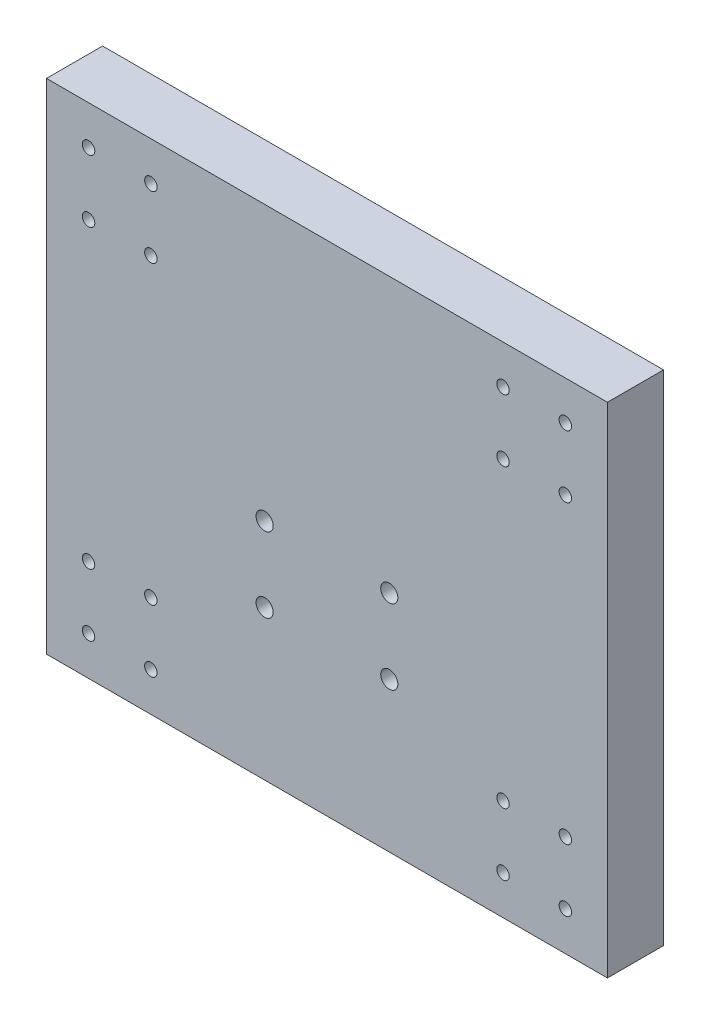
ISO-10303-21;
HEADER;
FILE_DESCRIPTION(('STEP AP214'),'2;1');
FILE_NAME('part.step','',(''),(''),'','','');
FILE_SCHEMA(('AUTOMOTIVE_DESIGN { 1 0 10303 214 1 1 1 1 }'));
ENDSEC;
DATA;
#1=APPLICATION_CONTEXT('core data for automotive mechanical design processes');
#2=APPLICATION_PROTOCOL_DEFINITION('international standard','automotive_design',2000,#1);
#3=PRODUCT_CONTEXT('',#1,'mechanical');
#4=PRODUCT('Part','Part','',(#3));
#5=PRODUCT_RELATED_PRODUCT_CATEGORY('part','',(#4));
#6=PRODUCT_DEFINITION_FORMATION('','',#4);
#7=PRODUCT_DEFINITION_CONTEXT('part definition',#1,'design');
#8=PRODUCT_DEFINITION('design','',#6,#7);
#9=PRODUCT_DEFINITION_SHAPE('','',#8);
#10=(LENGTH_UNIT() NAMED_UNIT(*) SI_UNIT(.MILLI.,.METRE.));
#11=(NAMED_UNIT(*) PLANE_ANGLE_UNIT() SI_UNIT($,.RADIAN.));
#12=(NAMED_UNIT(*) SI_UNIT($,.STERADIAN.) SOLID_ANGLE_UNIT());
#13=UNCERTAINTY_MEASURE_WITH_UNIT(LENGTH_MEASURE(1.E-05),#10,'distance_accuracy_value','');
#14=(GEOMETRIC_REPRESENTATION_CONTEXT(3) GLOBAL_UNCERTAINTY_ASSIGNED_CONTEXT((#13)) GLOBAL_UNIT_ASSIGNED_CONTEXT((#10,
#11,#12)) REPRESENTATION_CONTEXT('',''));
#15=CARTESIAN_POINT('',(0.,0.,0.));
#16=DIRECTION('',(0.,0.,1.));
#17=DIRECTION('',(1.,0.,0.));
#18=AXIS2_PLACEMENT_3D('',#15,#16,#17);
#19=CARTESIAN_POINT('',(0.,0.,-18.));
#20=DIRECTION('',(0.,0.,-1.));
#21=DIRECTION('',(-1.,0.,0.));
#22=AXIS2_PLACEMENT_3D('',#19,#20,#21);
#23=PLANE('',#22);
#24=CARTESIAN_POINT('',(20.,-32.,-18.));
#25=DIRECTION('',(0.,0.,-1.));
#26=DIRECTION('',(1.,0.,0.));
#27=AXIS2_PLACEMENT_3D('',#24,#25,#26);
#28=CIRCLE('',#27,2.74999999999999);
#29=CARTESIAN_POINT('',(22.75,-32.,-18.));
#30=VERTEX_POINT('',#29);
#31=EDGE_CURVE('E312',#30,#30,#28,.T.);
#32=ORIENTED_EDGE('',*,*,#31,.F.);
#33=EDGE_LOOP('',(#32));
#34=FACE_BOUND('',#33,.T.);
#35=CARTESIAN_POINT('',(-20.,-32.,-18.));
#36=DIRECTION('',(0.,0.,-1.));
#37=DIRECTION('',(-1.,0.,0.));
#38=AXIS2_PLACEMENT_3D('',#35,#36,#37);
#39=CIRCLE('',#38,2.74999999999999);
#40=CARTESIAN_POINT('',(-22.75,-32.,-18.));
#41=VERTEX_POINT('',#40);
#42=EDGE_CURVE('E318',#41,#41,#39,.T.);
#43=ORIENTED_EDGE('',*,*,#42,.F.);
#44=EDGE_LOOP('',(#43));
#45=FACE_BOUND('',#44,.T.);
#46=CARTESIAN_POINT('',(-20.,-7.99999999999998,-18.));
#47=DIRECTION('',(0.,0.,-1.));
#48=DIRECTION('',(1.,0.,0.));
#49=AXIS2_PLACEMENT_3D('',#46,#47,#48);
#50=CIRCLE('',#49,2.75);
#51=CARTESIAN_POINT('',(-17.25,-7.99999999999998,-18.));
#52=VERTEX_POINT('',#51);
#53=EDGE_CURVE('E326',#52,#52,#50,.T.);
#54=ORIENTED_EDGE('',*,*,#53,.F.);
#55=EDGE_LOOP('',(#54));
#56=FACE_BOUND('',#55,.T.);
#57=CARTESIAN_POINT('',(20.,-7.99999999999999,-18.));
#58=DIRECTION('',(0.,0.,-1.));
#59=DIRECTION('',(-1.,0.,0.));
#60=AXIS2_PLACEMENT_3D('',#57,#58,#59);
#61=CIRCLE('',#60,2.75);
#62=CARTESIAN_POINT('',(17.25,-7.99999999999999,-18.));
#63=VERTEX_POINT('',#62);
#64=EDGE_CURVE('E315',#63,#63,#61,.T.);
#65=ORIENTED_EDGE('',*,*,#64,.F.);
#66=EDGE_LOOP('',(#65));
#67=FACE_BOUND('',#66,.T.);
#68=CARTESIAN_POINT('',(56.5,-47.5,-18.));
#69=DIRECTION('',(0.,0.,1.));
#70=DIRECTION('',(1.,0.,0.));
#71=AXIS2_PLACEMENT_3D('',#68,#69,#70);
#72=CIRCLE('',#71,2.);
#73=CARTESIAN_POINT('',(58.5,-47.5,-18.));
#74=VERTEX_POINT('',#73);
#75=EDGE_CURVE('E131',#74,#74,#72,.F.);
#76=ORIENTED_EDGE('',*,*,#75,.F.);
#77=EDGE_LOOP('',(#76));
#78=FACE_BOUND('',#77,.T.);
#79=CARTESIAN_POINT('',(56.5,-67.5,-18.));
#80=DIRECTION('',(0.,0.,1.));
#81=DIRECTION('',(1.,0.,0.));
#82=AXIS2_PLACEMENT_3D('',#79,#80,#81);
#83=CIRCLE('',#82,2.);
#84=CARTESIAN_POINT('',(58.5,-67.5,-18.));
#85=VERTEX_POINT('',#84);
#86=EDGE_CURVE('E137',#85,#85,#83,.F.);
#87=ORIENTED_EDGE('',*,*,#86,.F.);
#88=EDGE_LOOP('',(#87));
#89=FACE_BOUND('',#88,.T.);
#90=CARTESIAN_POINT('',(-76.5,-47.5,-18.));
#91=DIRECTION('',(0.,0.,1.));
#92=DIRECTION('',(1.,0.,0.));
#93=AXIS2_PLACEMENT_3D('',#90,#91,#92);
#94=CIRCLE('',#93,2.);
#95=CARTESIAN_POINT('',(-74.5,-47.5,-18.));
#96=VERTEX_POINT('',#95);
#97=EDGE_CURVE('E107',#96,#96,#94,.F.);
#98=ORIENTED_EDGE('',*,*,#97,.F.);
#99=EDGE_LOOP('',(#98));
#100=FACE_BOUND('',#99,.T.);
#101=CARTESIAN_POINT('',(-76.5,-67.5,-18.));
#102=DIRECTION('',(0.,0.,1.));
#103=DIRECTION('',(1.,0.,0.));
#104=AXIS2_PLACEMENT_3D('',#101,#102,#103);
#105=CIRCLE('',#104,2.);
#106=CARTESIAN_POINT('',(-74.5,-67.5,-18.));
#107=VERTEX_POINT('',#106);
#108=EDGE_CURVE('E113',#107,#107,#105,.F.);
#109=ORIENTED_EDGE('',*,*,#108,.F.);
#110=EDGE_LOOP('',(#109));
#111=FACE_BOUND('',#110,.T.);
#112=CARTESIAN_POINT('',(76.5,47.5,-18.));
#113=DIRECTION('',(0.,0.,1.));
#114=DIRECTION('',(1.,0.,0.));
#115=AXIS2_PLACEMENT_3D('',#112,#113,#114);
#116=CIRCLE('',#115,2.);
#117=CARTESIAN_POINT('',(78.5,47.5,-18.));
#118=VERTEX_POINT('',#117);
#119=EDGE_CURVE('E179',#118,#118,#116,.F.);
#120=ORIENTED_EDGE('',*,*,#119,.F.);
#121=EDGE_LOOP('',(#120));
#122=FACE_BOUND('',#121,.T.);
#123=CARTESIAN_POINT('',(76.5,67.5,-18.));
#124=DIRECTION('',(0.,0.,1.));
#125=DIRECTION('',(1.,0.,0.));
#126=AXIS2_PLACEMENT_3D('',#123,#124,#125);
#127=CIRCLE('',#126,2.00000000000002);
#128=CARTESIAN_POINT('',(78.5000000000001,67.5,-18.));
#129=VERTEX_POINT('',#128);
#130=EDGE_CURVE('E173',#129,#129,#127,.F.);
#131=ORIENTED_EDGE('',*,*,#130,.F.);
#132=EDGE_LOOP('',(#131));
#133=FACE_BOUND('',#132,.T.);
#134=CARTESIAN_POINT('',(-56.5,47.5,-18.));
#135=DIRECTION('',(0.,0.,1.));
#136=DIRECTION('',(1.,0.,0.));
#137=AXIS2_PLACEMENT_3D('',#134,#135,#136);
#138=CIRCLE('',#137,2.);
#139=CARTESIAN_POINT('',(-54.5,47.5,-18.));
#140=VERTEX_POINT('',#139);
#141=EDGE_CURVE('E161',#140,#140,#138,.F.);
#142=ORIENTED_EDGE('',*,*,#141,.F.);
#143=EDGE_LOOP('',(#142));
#144=FACE_BOUND('',#143,.T.);
#145=CARTESIAN_POINT('',(-56.5,67.5,-18.));
#146=DIRECTION('',(0.,0.,1.));
#147=DIRECTION('',(1.,0.,0.));
#148=AXIS2_PLACEMENT_3D('',#145,#146,#147);
#149=CIRCLE('',#148,2.);
#150=CARTESIAN_POINT('',(-54.5,67.5,-18.));
#151=VERTEX_POINT('',#150);
#152=EDGE_CURVE('E155',#151,#151,#149,.F.);
#153=ORIENTED_EDGE('',*,*,#152,.F.);
#154=EDGE_LOOP('',(#153));
#155=FACE_BOUND('',#154,.T.);
#156=CARTESIAN_POINT('',(-76.5,67.5,-18.));
#157=DIRECTION('',(0.,0.,1.));
#158=DIRECTION('',(1.,0.,0.));
#159=AXIS2_PLACEMENT_3D('',#156,#157,#158);
#160=CIRCLE('',#159,2.);
#161=CARTESIAN_POINT('',(-74.5,67.5,-18.));
#162=VERTEX_POINT('',#161);
#163=EDGE_CURVE('E193',#162,#162,#160,.T.);
#164=ORIENTED_EDGE('',*,*,#163,.T.);
#165=EDGE_LOOP('',(#164));
#166=FACE_BOUND('',#165,.T.);
#167=DIRECTION('',(-1.,0.,0.));
#168=VECTOR('',#167,1.);
#169=CARTESIAN_POINT('',(-80.,80.,-18.));
#170=LINE('',#169,#168);
#171=CARTESIAN_POINT('',(90.,80.,-18.));
#172=VERTEX_POINT('',#171);
#173=CARTESIAN_POINT('',(-90.,80.,-18.));
#174=VERTEX_POINT('',#173);
#175=EDGE_CURVE('E43',#172,#174,#170,.T.);
#176=ORIENTED_EDGE('',*,*,#175,.F.);
#177=DIRECTION('',(0.,1.,0.));
#178=VECTOR('',#177,1.);
#179=CARTESIAN_POINT('',(90.,-100.591260281974,-18.));
#180=LINE('',#179,#178);
#181=CARTESIAN_POINT('',(90.,-80.,-18.));
#182=VERTEX_POINT('',#181);
#183=EDGE_CURVE('E73',#182,#172,#180,.T.);
#184=ORIENTED_EDGE('',*,*,#183,.F.);
#185=DIRECTION('',(1.,0.,0.));
#186=VECTOR('',#185,1.);
#187=CARTESIAN_POINT('',(-80.,-80.,-18.));
#188=LINE('',#187,#186);
#189=CARTESIAN_POINT('',(-90.,-80.,-18.));
#190=VERTEX_POINT('',#189);
#191=EDGE_CURVE('E11',#190,#182,#188,.T.);
#192=ORIENTED_EDGE('',*,*,#191,.F.);
#193=DIRECTION('',(0.,1.,0.));
#194=VECTOR('',#193,1.);
#195=CARTESIAN_POINT('',(-90.,-100.591260281974,-18.));
#196=LINE('',#195,#194);
#197=EDGE_CURVE('E71',#190,#174,#196,.T.);
#198=ORIENTED_EDGE('',*,*,#197,.T.);
#199=EDGE_LOOP('',(#176,#184,#192,#198));
#200=FACE_BOUND('',#199,.T.);
#201=CARTESIAN_POINT('',(-76.5,47.5,-18.));
#202=DIRECTION('',(0.,0.,1.));
#203=DIRECTION('',(1.,0.,0.));
#204=AXIS2_PLACEMENT_3D('',#201,#202,#203);
#205=CIRCLE('',#204,2.);
#206=CARTESIAN_POINT('',(-74.5,47.5,-18.));
#207=VERTEX_POINT('',#206);
#208=EDGE_CURVE('E167',#207,#207,#205,.T.);
#209=ORIENTED_EDGE('',*,*,#208,.T.);
#210=EDGE_LOOP('',(#209));
#211=FACE_BOUND('',#210,.T.);
#212=CARTESIAN_POINT('',(76.5,-47.5,-18.));
#213=DIRECTION('',(0.,0.,1.));
#214=DIRECTION('',(1.,0.,0.));
#215=AXIS2_PLACEMENT_3D('',#212,#213,#214);
#216=CIRCLE('',#215,2.);
#217=CARTESIAN_POINT('',(78.5,-47.5,-18.));
#218=VERTEX_POINT('',#217);
#219=EDGE_CURVE('E185',#218,#218,#216,.T.);
#220=ORIENTED_EDGE('',*,*,#219,.T.);
#221=EDGE_LOOP('',(#220));
#222=FACE_BOUND('',#221,.T.);
#223=CARTESIAN_POINT('',(76.5,-67.5,-18.));
#224=DIRECTION('',(0.,0.,1.));
#225=DIRECTION('',(1.,0.,0.));
#226=AXIS2_PLACEMENT_3D('',#223,#224,#225);
#227=CIRCLE('',#226,2.00000000000002);
#228=CARTESIAN_POINT('',(78.5000000000001,-67.5,-18.));
#229=VERTEX_POINT('',#228);
#230=EDGE_CURVE('E130',#229,#229,#227,.T.);
#231=ORIENTED_EDGE('',*,*,#230,.T.);
#232=EDGE_LOOP('',(#231));
#233=FACE_BOUND('',#232,.T.);
#234=CARTESIAN_POINT('',(56.5,47.5,-18.));
#235=DIRECTION('',(0.,0.,1.));
#236=DIRECTION('',(1.,0.,0.));
#237=AXIS2_PLACEMENT_3D('',#234,#235,#236);
#238=CIRCLE('',#237,2.);
#239=CARTESIAN_POINT('',(58.5,47.5,-18.));
#240=VERTEX_POINT('',#239);
#241=EDGE_CURVE('E100',#240,#240,#238,.T.);
#242=ORIENTED_EDGE('',*,*,#241,.T.);
#243=EDGE_LOOP('',(#242));
#244=FACE_BOUND('',#243,.T.);
#245=CARTESIAN_POINT('',(56.5,67.5,-18.));
#246=DIRECTION('',(0.,0.,1.));
#247=DIRECTION('',(1.,0.,0.));
#248=AXIS2_PLACEMENT_3D('',#245,#246,#247);
#249=CIRCLE('',#248,2.);
#250=CARTESIAN_POINT('',(58.5,67.5,-18.));
#251=VERTEX_POINT('',#250);
#252=EDGE_CURVE('E119',#251,#251,#249,.T.);
#253=ORIENTED_EDGE('',*,*,#252,.T.);
#254=EDGE_LOOP('',(#253));
#255=FACE_BOUND('',#254,.T.);
#256=CARTESIAN_POINT('',(-56.5,-67.5,-18.));
#257=DIRECTION('',(0.,0.,1.));
#258=DIRECTION('',(1.,0.,0.));
#259=AXIS2_PLACEMENT_3D('',#256,#257,#258);
#260=CIRCLE('',#259,2.);
#261=CARTESIAN_POINT('',(-54.5,-67.5,-18.));
#262=VERTEX_POINT('',#261);
#263=EDGE_CURVE('E106',#262,#262,#260,.T.);
#264=ORIENTED_EDGE('',*,*,#263,.T.);
#265=EDGE_LOOP('',(#264));
#266=FACE_BOUND('',#265,.T.);
#267=CARTESIAN_POINT('',(-56.5,-47.5,-18.));
#268=DIRECTION('',(0.,0.,1.));
#269=DIRECTION('',(1.,0.,0.));
#270=AXIS2_PLACEMENT_3D('',#267,#268,#269);
#271=CIRCLE('',#270,2.);
#272=CARTESIAN_POINT('',(-54.5,-47.5,-18.));
#273=VERTEX_POINT('',#272);
#274=EDGE_CURVE('E143',#273,#273,#271,.T.);
#275=ORIENTED_EDGE('',*,*,#274,.T.);
#276=EDGE_LOOP('',(#275));
#277=FACE_BOUND('',#276,.T.);
#278=ADVANCED_FACE('F33',(#34,#45,#56,#67,#78,#89,#100,#111,#122,#133,#144,#155,#166,#200,#211,
#222,#233,#244,#255,#266,#277),#23,.T.);
#279=CARTESIAN_POINT('',(0.,0.,0.));
#280=DIRECTION('',(0.,0.,-1.));
#281=DIRECTION('',(-1.,0.,0.));
#282=AXIS2_PLACEMENT_3D('',#279,#280,#281);
#283=PLANE('',#282);
#284=CARTESIAN_POINT('',(20.,-32.,0.));
#285=DIRECTION('',(0.,0.,-1.));
#286=DIRECTION('',(1.,0.,0.));
#287=AXIS2_PLACEMENT_3D('',#284,#285,#286);
#288=CIRCLE('',#287,2.74999999999999);
#289=CARTESIAN_POINT('',(22.75,-32.,0.));
#290=VERTEX_POINT('',#289);
#291=EDGE_CURVE('E310',#290,#290,#288,.T.);
#292=ORIENTED_EDGE('',*,*,#291,.T.);
#293=EDGE_LOOP('',(#292));
#294=FACE_BOUND('',#293,.T.);
#295=CARTESIAN_POINT('',(-20.,-32.,0.));
#296=DIRECTION('',(0.,0.,-1.));
#297=DIRECTION('',(-1.,0.,0.));
#298=AXIS2_PLACEMENT_3D('',#295,#296,#297);
#299=CIRCLE('',#298,2.74999999999999);
#300=CARTESIAN_POINT('',(-22.75,-32.,0.));
#301=VERTEX_POINT('',#300);
#302=EDGE_CURVE('E313',#301,#301,#299,.T.);
#303=ORIENTED_EDGE('',*,*,#302,.T.);
#304=EDGE_LOOP('',(#303));
#305=FACE_BOUND('',#304,.T.);
#306=CARTESIAN_POINT('',(-20.,-7.99999999999998,0.));
#307=DIRECTION('',(0.,0.,-1.));
#308=DIRECTION('',(1.,0.,0.));
#309=AXIS2_PLACEMENT_3D('',#306,#307,#308);
#310=CIRCLE('',#309,2.75);
#311=CARTESIAN_POINT('',(-17.25,-7.99999999999998,0.));
#312=VERTEX_POINT('',#311);
#313=EDGE_CURVE('E323',#312,#312,#310,.T.);
#314=ORIENTED_EDGE('',*,*,#313,.T.);
#315=EDGE_LOOP('',(#314));
#316=FACE_BOUND('',#315,.T.);
#317=CARTESIAN_POINT('',(20.,-7.99999999999999,0.));
#318=DIRECTION('',(0.,0.,-1.));
#319=DIRECTION('',(-1.,0.,0.));
#320=AXIS2_PLACEMENT_3D('',#317,#318,#319);
#321=CIRCLE('',#320,2.75);
#322=CARTESIAN_POINT('',(17.25,-7.99999999999999,0.));
#323=VERTEX_POINT('',#322);
#324=EDGE_CURVE('E89',#323,#323,#321,.T.);
#325=ORIENTED_EDGE('',*,*,#324,.T.);
#326=EDGE_LOOP('',(#325));
#327=FACE_BOUND('',#326,.T.);
#328=CARTESIAN_POINT('',(56.5,-47.5,0.));
#329=DIRECTION('',(0.,0.,1.));
#330=DIRECTION('',(1.,0.,0.));
#331=AXIS2_PLACEMENT_3D('',#328,#329,#330);
#332=CIRCLE('',#331,2.);
#333=CARTESIAN_POINT('',(58.5,-47.5,0.));
#334=VERTEX_POINT('',#333);
#335=EDGE_CURVE('E127',#334,#334,#332,.F.);
#336=ORIENTED_EDGE('',*,*,#335,.T.);
#337=EDGE_LOOP('',(#336));
#338=FACE_BOUND('',#337,.T.);
#339=CARTESIAN_POINT('',(56.5,-67.5,0.));
#340=DIRECTION('',(0.,0.,1.));
#341=DIRECTION('',(1.,0.,0.));
#342=AXIS2_PLACEMENT_3D('',#339,#340,#341);
#343=CIRCLE('',#342,2.);
#344=CARTESIAN_POINT('',(58.5,-67.5,0.));
#345=VERTEX_POINT('',#344);
#346=EDGE_CURVE('E134',#345,#345,#343,.F.);
#347=ORIENTED_EDGE('',*,*,#346,.T.);
#348=EDGE_LOOP('',(#347));
#349=FACE_BOUND('',#348,.T.);
#350=CARTESIAN_POINT('',(-56.5,-67.5,0.));
#351=DIRECTION('',(0.,0.,1.));
#352=DIRECTION('',(1.,0.,0.));
#353=AXIS2_PLACEMENT_3D('',#350,#351,#352);
#354=CIRCLE('',#353,2.);
#355=CARTESIAN_POINT('',(-54.5,-67.5,0.));
#356=VERTEX_POINT('',#355);
#357=EDGE_CURVE('E146',#356,#356,#354,.T.);
#358=ORIENTED_EDGE('',*,*,#357,.F.);
#359=EDGE_LOOP('',(#358));
#360=FACE_BOUND('',#359,.T.);
#361=CARTESIAN_POINT('',(-76.5,-47.5,0.));
#362=DIRECTION('',(0.,0.,1.));
#363=DIRECTION('',(1.,0.,0.));
#364=AXIS2_PLACEMENT_3D('',#361,#362,#363);
#365=CIRCLE('',#364,2.);
#366=CARTESIAN_POINT('',(-74.5,-47.5,0.));
#367=VERTEX_POINT('',#366);
#368=EDGE_CURVE('E103',#367,#367,#365,.F.);
#369=ORIENTED_EDGE('',*,*,#368,.T.);
#370=EDGE_LOOP('',(#369));
#371=FACE_BOUND('',#370,.T.);
#372=CARTESIAN_POINT('',(-76.5,-67.5,0.));
#373=DIRECTION('',(0.,0.,1.));
#374=DIRECTION('',(1.,0.,0.));
#375=AXIS2_PLACEMENT_3D('',#372,#373,#374);
#376=CIRCLE('',#375,2.);
#377=CARTESIAN_POINT('',(-74.5,-67.5,0.));
#378=VERTEX_POINT('',#377);
#379=EDGE_CURVE('E110',#378,#378,#376,.F.);
#380=ORIENTED_EDGE('',*,*,#379,.T.);
#381=EDGE_LOOP('',(#380));
#382=FACE_BOUND('',#381,.T.);
#383=CARTESIAN_POINT('',(56.5,47.5,0.));
#384=DIRECTION('',(0.,0.,1.));
#385=DIRECTION('',(1.,0.,0.));
#386=AXIS2_PLACEMENT_3D('',#383,#384,#385);
#387=CIRCLE('',#386,2.);
#388=CARTESIAN_POINT('',(58.5,47.5,0.));
#389=VERTEX_POINT('',#388);
#390=EDGE_CURVE('E122',#389,#389,#387,.T.);
#391=ORIENTED_EDGE('',*,*,#390,.F.);
#392=EDGE_LOOP('',(#391));
#393=FACE_BOUND('',#392,.T.);
#394=CARTESIAN_POINT('',(76.5,-47.5,0.));
#395=DIRECTION('',(0.,0.,1.));
#396=DIRECTION('',(1.,0.,0.));
#397=AXIS2_PLACEMENT_3D('',#394,#395,#396);
#398=CIRCLE('',#397,2.);
#399=CARTESIAN_POINT('',(78.5,-47.5,0.));
#400=VERTEX_POINT('',#399);
#401=EDGE_CURVE('E182',#400,#400,#398,.T.);
#402=ORIENTED_EDGE('',*,*,#401,.F.);
#403=EDGE_LOOP('',(#402));
#404=FACE_BOUND('',#403,.T.);
#405=CARTESIAN_POINT('',(76.5,47.5,0.));
#406=DIRECTION('',(0.,0.,1.));
#407=DIRECTION('',(1.,0.,0.));
#408=AXIS2_PLACEMENT_3D('',#405,#406,#407);
#409=CIRCLE('',#408,2.);
#410=CARTESIAN_POINT('',(78.5,47.5,0.));
#411=VERTEX_POINT('',#410);
#412=EDGE_CURVE('E176',#411,#411,#409,.F.);
#413=ORIENTED_EDGE('',*,*,#412,.T.);
#414=EDGE_LOOP('',(#413));
#415=FACE_BOUND('',#414,.T.);
#416=CARTESIAN_POINT('',(76.5,67.5,0.));
#417=DIRECTION('',(0.,0.,1.));
#418=DIRECTION('',(1.,0.,0.));
#419=AXIS2_PLACEMENT_3D('',#416,#417,#418);
#420=CIRCLE('',#419,2.00000000000002);
#421=CARTESIAN_POINT('',(78.5000000000001,67.5,0.));
#422=VERTEX_POINT('',#421);
#423=EDGE_CURVE('E170',#422,#422,#420,.F.);
#424=ORIENTED_EDGE('',*,*,#423,.T.);
#425=EDGE_LOOP('',(#424));
#426=FACE_BOUND('',#425,.T.);
#427=DIRECTION('',(1.,0.,0.));
#428=VECTOR('',#427,1.);
#429=CARTESIAN_POINT('',(-80.,-80.,0.));
#430=LINE('',#429,#428);
#431=CARTESIAN_POINT('',(-90.,-80.,0.));
#432=VERTEX_POINT('',#431);
#433=CARTESIAN_POINT('',(90.,-80.,0.));
#434=VERTEX_POINT('',#433);
#435=EDGE_CURVE('E37',#432,#434,#430,.T.);
#436=ORIENTED_EDGE('',*,*,#435,.T.);
#437=DIRECTION('',(0.,1.,0.));
#438=VECTOR('',#437,1.);
#439=CARTESIAN_POINT('',(90.,-100.591260281974,0.));
#440=LINE('',#439,#438);
#441=CARTESIAN_POINT('',(90.,80.,0.));
#442=VERTEX_POINT('',#441);
#443=EDGE_CURVE('E96',#434,#442,#440,.T.);
#444=ORIENTED_EDGE('',*,*,#443,.T.);
#445=DIRECTION('',(-1.,0.,0.));
#446=VECTOR('',#445,1.);
#447=CARTESIAN_POINT('',(-80.,80.,0.));
#448=LINE('',#447,#446);
#449=CARTESIAN_POINT('',(-90.,80.,0.));
#450=VERTEX_POINT('',#449);
#451=EDGE_CURVE('E196',#442,#450,#448,.T.);
#452=ORIENTED_EDGE('',*,*,#451,.T.);
#453=DIRECTION('',(0.,1.,0.));
#454=VECTOR('',#453,1.);
#455=CARTESIAN_POINT('',(-90.,-100.591260281974,0.));
#456=LINE('',#455,#454);
#457=EDGE_CURVE('E83',#432,#450,#456,.T.);
#458=ORIENTED_EDGE('',*,*,#457,.F.);
#459=EDGE_LOOP('',(#436,#444,#452,#458));
#460=FACE_BOUND('',#459,.T.);
#461=CARTESIAN_POINT('',(-76.5,67.5,0.));
#462=DIRECTION('',(0.,0.,1.));
#463=DIRECTION('',(1.,0.,0.));
#464=AXIS2_PLACEMENT_3D('',#461,#462,#463);
#465=CIRCLE('',#464,2.);
#466=CARTESIAN_POINT('',(-74.5,67.5,0.));
#467=VERTEX_POINT('',#466);
#468=EDGE_CURVE('E154',#467,#467,#465,.T.);
#469=ORIENTED_EDGE('',*,*,#468,.F.);
#470=EDGE_LOOP('',(#469));
#471=FACE_BOUND('',#470,.T.);
#472=CARTESIAN_POINT('',(-56.5,67.5,0.));
#473=DIRECTION('',(0.,0.,1.));
#474=DIRECTION('',(1.,0.,0.));
#475=AXIS2_PLACEMENT_3D('',#472,#473,#474);
#476=CIRCLE('',#475,2.);
#477=CARTESIAN_POINT('',(-54.5,67.5,0.));
#478=VERTEX_POINT('',#477);
#479=EDGE_CURVE('E151',#478,#478,#476,.F.);
#480=ORIENTED_EDGE('',*,*,#479,.T.);
#481=EDGE_LOOP('',(#480));
#482=FACE_BOUND('',#481,.T.);
#483=CARTESIAN_POINT('',(-56.5,47.5,0.));
#484=DIRECTION('',(0.,0.,1.));
#485=DIRECTION('',(1.,0.,0.));
#486=AXIS2_PLACEMENT_3D('',#483,#484,#485);
#487=CIRCLE('',#486,2.);
#488=CARTESIAN_POINT('',(-54.5,47.5,0.));
#489=VERTEX_POINT('',#488);
#490=EDGE_CURVE('E158',#489,#489,#487,.F.);
#491=ORIENTED_EDGE('',*,*,#490,.T.);
#492=EDGE_LOOP('',(#491));
#493=FACE_BOUND('',#492,.T.);
#494=CARTESIAN_POINT('',(-76.5,47.5,0.));
#495=DIRECTION('',(0.,0.,1.));
#496=DIRECTION('',(1.,0.,0.));
#497=AXIS2_PLACEMENT_3D('',#494,#495,#496);
#498=CIRCLE('',#497,2.);
#499=CARTESIAN_POINT('',(-74.5,47.5,0.));
#500=VERTEX_POINT('',#499);
#501=EDGE_CURVE('E164',#500,#500,#498,.T.);
#502=ORIENTED_EDGE('',*,*,#501,.F.);
#503=EDGE_LOOP('',(#502));
#504=FACE_BOUND('',#503,.T.);
#505=CARTESIAN_POINT('',(76.5,-67.5,0.));
#506=DIRECTION('',(0.,0.,1.));
#507=DIRECTION('',(1.,0.,0.));
#508=AXIS2_PLACEMENT_3D('',#505,#506,#507);
#509=CIRCLE('',#508,2.00000000000002);
#510=CARTESIAN_POINT('',(78.5000000000001,-67.5,0.));
#511=VERTEX_POINT('',#510);
#512=EDGE_CURVE('E188',#511,#511,#509,.T.);
#513=ORIENTED_EDGE('',*,*,#512,.F.);
#514=EDGE_LOOP('',(#513));
#515=FACE_BOUND('',#514,.T.);
#516=CARTESIAN_POINT('',(56.5,67.5,0.));
#517=DIRECTION('',(0.,0.,1.));
#518=DIRECTION('',(1.,0.,0.));
#519=AXIS2_PLACEMENT_3D('',#516,#517,#518);
#520=CIRCLE('',#519,2.);
#521=CARTESIAN_POINT('',(58.5,67.5,0.));
#522=VERTEX_POINT('',#521);
#523=EDGE_CURVE('E116',#522,#522,#520,.T.);
#524=ORIENTED_EDGE('',*,*,#523,.F.);
#525=EDGE_LOOP('',(#524));
#526=FACE_BOUND('',#525,.T.);
#527=CARTESIAN_POINT('',(-56.5,-47.5,0.));
#528=DIRECTION('',(0.,0.,1.));
#529=DIRECTION('',(1.,0.,0.));
#530=AXIS2_PLACEMENT_3D('',#527,#528,#529);
#531=CIRCLE('',#530,2.);
#532=CARTESIAN_POINT('',(-54.5,-47.5,0.));
#533=VERTEX_POINT('',#532);
#534=EDGE_CURVE('E140',#533,#533,#531,.T.);
#535=ORIENTED_EDGE('',*,*,#534,.F.);
#536=EDGE_LOOP('',(#535));
#537=FACE_BOUND('',#536,.T.);
#538=ADVANCED_FACE('F200',(#294,#305,#316,#327,#338,#349,#360,#371,#382,#393,#404,#415,#426,
#460,#471,#482,#493,#504,#515,#526,#537),#283,.F.);
#539=CARTESIAN_POINT('',(-80.,-80.,-18.));
#540=DIRECTION('',(0.,-1.,0.));
#541=DIRECTION('',(0.,0.,-1.));
#542=AXIS2_PLACEMENT_3D('',#539,#540,#541);
#543=PLANE('',#542);
#544=ORIENTED_EDGE('',*,*,#435,.F.);
#545=DIRECTION('',(0.,0.,1.));
#546=VECTOR('',#545,1.);
#547=CARTESIAN_POINT('',(-90.,-80.,-18.));
#548=LINE('',#547,#546);
#549=EDGE_CURVE('E78',#190,#432,#548,.T.);
#550=ORIENTED_EDGE('',*,*,#549,.F.);
#551=ORIENTED_EDGE('',*,*,#191,.T.);
#552=DIRECTION('',(0.,0.,-1.));
#553=VECTOR('',#552,1.);
#554=CARTESIAN_POINT('',(90.,-80.,0.));
#555=LINE('',#554,#553);
#556=EDGE_CURVE('E97',#434,#182,#555,.T.);
#557=ORIENTED_EDGE('',*,*,#556,.F.);
#558=EDGE_LOOP('',(#544,#550,#551,#557));
#559=FACE_BOUND('',#558,.T.);
#560=ADVANCED_FACE('F79',(#559),#543,.T.);
#561=CARTESIAN_POINT('',(-80.,80.,-18.));
#562=DIRECTION('',(0.,1.,0.));
#563=DIRECTION('',(0.,0.,1.));
#564=AXIS2_PLACEMENT_3D('',#561,#562,#563);
#565=PLANE('',#564);
#566=ORIENTED_EDGE('',*,*,#451,.F.);
#567=DIRECTION('',(0.,0.,-1.));
#568=VECTOR('',#567,1.);
#569=CARTESIAN_POINT('',(90.,80.,0.));
#570=LINE('',#569,#568);
#571=EDGE_CURVE('E93',#442,#172,#570,.T.);
#572=ORIENTED_EDGE('',*,*,#571,.T.);
#573=ORIENTED_EDGE('',*,*,#175,.T.);
#574=DIRECTION('',(0.,0.,1.));
#575=VECTOR('',#574,1.);
#576=CARTESIAN_POINT('',(-90.,80.,-18.));
#577=LINE('',#576,#575);
#578=EDGE_CURVE('E87',#174,#450,#577,.T.);
#579=ORIENTED_EDGE('',*,*,#578,.T.);
#580=EDGE_LOOP('',(#566,#572,#573,#579));
#581=FACE_BOUND('',#580,.T.);
#582=ADVANCED_FACE('F35',(#581),#565,.T.);
#583=CARTESIAN_POINT('',(-76.5,67.5,-18.));
#584=DIRECTION('',(0.,0.,1.));
#585=DIRECTION('',(1.,0.,0.));
#586=AXIS2_PLACEMENT_3D('',#583,#584,#585);
#587=CYLINDRICAL_SURFACE('',#586,2.);
#588=ORIENTED_EDGE('',*,*,#163,.F.);
#589=EDGE_LOOP('',(#588));
#590=FACE_BOUND('',#589,.T.);
#591=ORIENTED_EDGE('',*,*,#468,.T.);
#592=EDGE_LOOP('',(#591));
#593=FACE_BOUND('',#592,.T.);
#594=ADVANCED_FACE('F208',(#590,#593),#587,.F.);
#595=CARTESIAN_POINT('',(-56.5,67.5,-18.));
#596=DIRECTION('',(0.,0.,1.));
#597=DIRECTION('',(1.,0.,0.));
#598=AXIS2_PLACEMENT_3D('',#595,#596,#597);
#599=CYLINDRICAL_SURFACE('',#598,2.);
#600=ORIENTED_EDGE('',*,*,#152,.T.);
#601=EDGE_LOOP('',(#600));
#602=FACE_BOUND('',#601,.T.);
#603=ORIENTED_EDGE('',*,*,#479,.F.);
#604=EDGE_LOOP('',(#603));
#605=FACE_BOUND('',#604,.T.);
#606=ADVANCED_FACE('F213',(#602,#605),#599,.F.);
#607=CARTESIAN_POINT('',(-56.5,47.5,-18.));
#608=DIRECTION('',(0.,0.,1.));
#609=DIRECTION('',(1.,0.,0.));
#610=AXIS2_PLACEMENT_3D('',#607,#608,#609);
#611=CYLINDRICAL_SURFACE('',#610,2.);
#612=ORIENTED_EDGE('',*,*,#141,.T.);
#613=EDGE_LOOP('',(#612));
#614=FACE_BOUND('',#613,.T.);
#615=ORIENTED_EDGE('',*,*,#490,.F.);
#616=EDGE_LOOP('',(#615));
#617=FACE_BOUND('',#616,.T.);
#618=ADVANCED_FACE('F247',(#614,#617),#611,.F.);
#619=CARTESIAN_POINT('',(-76.5,47.5,-18.));
#620=DIRECTION('',(0.,0.,1.));
#621=DIRECTION('',(1.,0.,0.));
#622=AXIS2_PLACEMENT_3D('',#619,#620,#621);
#623=CYLINDRICAL_SURFACE('',#622,2.);
#624=ORIENTED_EDGE('',*,*,#208,.F.);
#625=EDGE_LOOP('',(#624));
#626=FACE_BOUND('',#625,.T.);
#627=ORIENTED_EDGE('',*,*,#501,.T.);
#628=EDGE_LOOP('',(#627));
#629=FACE_BOUND('',#628,.T.);
#630=ADVANCED_FACE('F243',(#626,#629),#623,.F.);
#631=CARTESIAN_POINT('',(76.5,67.5,-18.));
#632=DIRECTION('',(0.,0.,1.));
#633=DIRECTION('',(1.,0.,0.));
#634=AXIS2_PLACEMENT_3D('',#631,#632,#633);
#635=CYLINDRICAL_SURFACE('',#634,2.00000000000002);
#636=ORIENTED_EDGE('',*,*,#130,.T.);
#637=EDGE_LOOP('',(#636));
#638=FACE_BOUND('',#637,.T.);
#639=ORIENTED_EDGE('',*,*,#423,.F.);
#640=EDGE_LOOP('',(#639));
#641=FACE_BOUND('',#640,.T.);
#642=ADVANCED_FACE('F239',(#638,#641),#635,.F.);
#643=CARTESIAN_POINT('',(76.5,47.5,-18.));
#644=DIRECTION('',(0.,0.,1.));
#645=DIRECTION('',(1.,0.,0.));
#646=AXIS2_PLACEMENT_3D('',#643,#644,#645);
#647=CYLINDRICAL_SURFACE('',#646,2.);
#648=ORIENTED_EDGE('',*,*,#119,.T.);
#649=EDGE_LOOP('',(#648));
#650=FACE_BOUND('',#649,.T.);
#651=ORIENTED_EDGE('',*,*,#412,.F.);
#652=EDGE_LOOP('',(#651));
#653=FACE_BOUND('',#652,.T.);
#654=ADVANCED_FACE('F235',(#650,#653),#647,.F.);
#655=CARTESIAN_POINT('',(76.5,-47.5,-18.));
#656=DIRECTION('',(0.,0.,1.));
#657=DIRECTION('',(1.,0.,0.));
#658=AXIS2_PLACEMENT_3D('',#655,#656,#657);
#659=CYLINDRICAL_SURFACE('',#658,2.);
#660=ORIENTED_EDGE('',*,*,#219,.F.);
#661=EDGE_LOOP('',(#660));
#662=FACE_BOUND('',#661,.T.);
#663=ORIENTED_EDGE('',*,*,#401,.T.);
#664=EDGE_LOOP('',(#663));
#665=FACE_BOUND('',#664,.T.);
#666=ADVANCED_FACE('F231',(#662,#665),#659,.F.);
#667=CARTESIAN_POINT('',(76.5,-67.5,-18.));
#668=DIRECTION('',(0.,0.,1.));
#669=DIRECTION('',(1.,0.,0.));
#670=AXIS2_PLACEMENT_3D('',#667,#668,#669);
#671=CYLINDRICAL_SURFACE('',#670,2.00000000000002);
#672=ORIENTED_EDGE('',*,*,#230,.F.);
#673=EDGE_LOOP('',(#672));
#674=FACE_BOUND('',#673,.T.);
#675=ORIENTED_EDGE('',*,*,#512,.T.);
#676=EDGE_LOOP('',(#675));
#677=FACE_BOUND('',#676,.T.);
#678=ADVANCED_FACE('F227',(#674,#677),#671,.F.);
#679=CARTESIAN_POINT('',(56.5,47.5,-18.));
#680=DIRECTION('',(0.,0.,1.));
#681=DIRECTION('',(1.,0.,0.));
#682=AXIS2_PLACEMENT_3D('',#679,#680,#681);
#683=CYLINDRICAL_SURFACE('',#682,2.);
#684=ORIENTED_EDGE('',*,*,#241,.F.);
#685=EDGE_LOOP('',(#684));
#686=FACE_BOUND('',#685,.T.);
#687=ORIENTED_EDGE('',*,*,#390,.T.);
#688=EDGE_LOOP('',(#687));
#689=FACE_BOUND('',#688,.T.);
#690=ADVANCED_FACE('F230',(#686,#689),#683,.F.);
#691=CARTESIAN_POINT('',(56.5,67.5,-18.));
#692=DIRECTION('',(0.,0.,1.));
#693=DIRECTION('',(1.,0.,0.));
#694=AXIS2_PLACEMENT_3D('',#691,#692,#693);
#695=CYLINDRICAL_SURFACE('',#694,2.);
#696=ORIENTED_EDGE('',*,*,#252,.F.);
#697=EDGE_LOOP('',(#696));
#698=FACE_BOUND('',#697,.T.);
#699=ORIENTED_EDGE('',*,*,#523,.T.);
#700=EDGE_LOOP('',(#699));
#701=FACE_BOUND('',#700,.T.);
#702=ADVANCED_FACE('F274',(#698,#701),#695,.F.);
#703=CARTESIAN_POINT('',(-76.5,-67.5,-18.));
#704=DIRECTION('',(0.,0.,1.));
#705=DIRECTION('',(1.,0.,0.));
#706=AXIS2_PLACEMENT_3D('',#703,#704,#705);
#707=CYLINDRICAL_SURFACE('',#706,2.);
#708=ORIENTED_EDGE('',*,*,#108,.T.);
#709=EDGE_LOOP('',(#708));
#710=FACE_BOUND('',#709,.T.);
#711=ORIENTED_EDGE('',*,*,#379,.F.);
#712=EDGE_LOOP('',(#711));
#713=FACE_BOUND('',#712,.T.);
#714=ADVANCED_FACE('F278',(#710,#713),#707,.F.);
#715=CARTESIAN_POINT('',(-76.5,-47.5,-18.));
#716=DIRECTION('',(0.,0.,1.));
#717=DIRECTION('',(1.,0.,0.));
#718=AXIS2_PLACEMENT_3D('',#715,#716,#717);
#719=CYLINDRICAL_SURFACE('',#718,2.);
#720=ORIENTED_EDGE('',*,*,#97,.T.);
#721=EDGE_LOOP('',(#720));
#722=FACE_BOUND('',#721,.T.);
#723=ORIENTED_EDGE('',*,*,#368,.F.);
#724=EDGE_LOOP('',(#723));
#725=FACE_BOUND('',#724,.T.);
#726=ADVANCED_FACE('F259',(#722,#725),#719,.F.);
#727=CARTESIAN_POINT('',(-56.5,-67.5,-18.));
#728=DIRECTION('',(0.,0.,1.));
#729=DIRECTION('',(1.,0.,0.));
#730=AXIS2_PLACEMENT_3D('',#727,#728,#729);
#731=CYLINDRICAL_SURFACE('',#730,2.);
#732=ORIENTED_EDGE('',*,*,#263,.F.);
#733=EDGE_LOOP('',(#732));
#734=FACE_BOUND('',#733,.T.);
#735=ORIENTED_EDGE('',*,*,#357,.T.);
#736=EDGE_LOOP('',(#735));
#737=FACE_BOUND('',#736,.T.);
#738=ADVANCED_FACE('F255',(#734,#737),#731,.F.);
#739=CARTESIAN_POINT('',(-56.5,-47.5,-18.));
#740=DIRECTION('',(0.,0.,1.));
#741=DIRECTION('',(1.,0.,0.));
#742=AXIS2_PLACEMENT_3D('',#739,#740,#741);
#743=CYLINDRICAL_SURFACE('',#742,2.);
#744=ORIENTED_EDGE('',*,*,#274,.F.);
#745=EDGE_LOOP('',(#744));
#746=FACE_BOUND('',#745,.T.);
#747=ORIENTED_EDGE('',*,*,#534,.T.);
#748=EDGE_LOOP('',(#747));
#749=FACE_BOUND('',#748,.T.);
#750=ADVANCED_FACE('F258',(#746,#749),#743,.F.);
#751=CARTESIAN_POINT('',(56.5,-67.5,-18.));
#752=DIRECTION('',(0.,0.,1.));
#753=DIRECTION('',(1.,0.,0.));
#754=AXIS2_PLACEMENT_3D('',#751,#752,#753);
#755=CYLINDRICAL_SURFACE('',#754,2.);
#756=ORIENTED_EDGE('',*,*,#86,.T.);
#757=EDGE_LOOP('',(#756));
#758=FACE_BOUND('',#757,.T.);
#759=ORIENTED_EDGE('',*,*,#346,.F.);
#760=EDGE_LOOP('',(#759));
#761=FACE_BOUND('',#760,.T.);
#762=ADVANCED_FACE('F263',(#758,#761),#755,.F.);
#763=CARTESIAN_POINT('',(56.5,-47.5,-18.));
#764=DIRECTION('',(0.,0.,1.));
#765=DIRECTION('',(1.,0.,0.));
#766=AXIS2_PLACEMENT_3D('',#763,#764,#765);
#767=CYLINDRICAL_SURFACE('',#766,2.);
#768=ORIENTED_EDGE('',*,*,#75,.T.);
#769=EDGE_LOOP('',(#768));
#770=FACE_BOUND('',#769,.T.);
#771=ORIENTED_EDGE('',*,*,#335,.F.);
#772=EDGE_LOOP('',(#771));
#773=FACE_BOUND('',#772,.T.);
#774=ADVANCED_FACE('F267',(#770,#773),#767,.F.);
#775=CARTESIAN_POINT('',(90.,-100.591260281974,0.));
#776=DIRECTION('',(1.,0.,0.));
#777=DIRECTION('',(0.,0.,-1.));
#778=AXIS2_PLACEMENT_3D('',#775,#776,#777);
#779=PLANE('',#778);
#780=ORIENTED_EDGE('',*,*,#443,.F.);
#781=ORIENTED_EDGE('',*,*,#556,.T.);
#782=ORIENTED_EDGE('',*,*,#183,.T.);
#783=ORIENTED_EDGE('',*,*,#571,.F.);
#784=EDGE_LOOP('',(#780,#781,#782,#783));
#785=FACE_BOUND('',#784,.T.);
#786=ADVANCED_FACE('F205',(#785),#779,.T.);
#787=CARTESIAN_POINT('',(-90.,-100.591260281974,-18.));
#788=DIRECTION('',(-1.,0.,0.));
#789=DIRECTION('',(0.,0.,1.));
#790=AXIS2_PLACEMENT_3D('',#787,#788,#789);
#791=PLANE('',#790);
#792=ORIENTED_EDGE('',*,*,#197,.F.);
#793=ORIENTED_EDGE('',*,*,#549,.T.);
#794=ORIENTED_EDGE('',*,*,#457,.T.);
#795=ORIENTED_EDGE('',*,*,#578,.F.);
#796=EDGE_LOOP('',(#792,#793,#794,#795));
#797=FACE_BOUND('',#796,.T.);
#798=ADVANCED_FACE('F85',(#797),#791,.T.);
#799=CARTESIAN_POINT('',(20.,-7.99999999999999,0.));
#800=DIRECTION('',(0.,0.,-1.));
#801=DIRECTION('',(-1.,0.,0.));
#802=AXIS2_PLACEMENT_3D('',#799,#800,#801);
#803=CYLINDRICAL_SURFACE('',#802,2.75);
#804=ORIENTED_EDGE('',*,*,#324,.F.);
#805=EDGE_LOOP('',(#804));
#806=FACE_BOUND('',#805,.T.);
#807=ORIENTED_EDGE('',*,*,#64,.T.);
#808=EDGE_LOOP('',(#807));
#809=FACE_BOUND('',#808,.T.);
#810=ADVANCED_FACE('F290',(#806,#809),#803,.F.);
#811=CARTESIAN_POINT('',(-20.,-7.99999999999998,0.));
#812=DIRECTION('',(0.,0.,-1.));
#813=DIRECTION('',(-1.,0.,0.));
#814=AXIS2_PLACEMENT_3D('',#811,#812,#813);
#815=CYLINDRICAL_SURFACE('',#814,2.75);
#816=ORIENTED_EDGE('',*,*,#313,.F.);
#817=EDGE_LOOP('',(#816));
#818=FACE_BOUND('',#817,.T.);
#819=ORIENTED_EDGE('',*,*,#53,.T.);
#820=EDGE_LOOP('',(#819));
#821=FACE_BOUND('',#820,.T.);
#822=ADVANCED_FACE('F293',(#818,#821),#815,.F.);
#823=CARTESIAN_POINT('',(-20.,-32.,0.));
#824=DIRECTION('',(0.,0.,-1.));
#825=DIRECTION('',(-1.,0.,0.));
#826=AXIS2_PLACEMENT_3D('',#823,#824,#825);
#827=CYLINDRICAL_SURFACE('',#826,2.74999999999999);
#828=ORIENTED_EDGE('',*,*,#302,.F.);
#829=EDGE_LOOP('',(#828));
#830=FACE_BOUND('',#829,.T.);
#831=ORIENTED_EDGE('',*,*,#42,.T.);
#832=EDGE_LOOP('',(#831));
#833=FACE_BOUND('',#832,.T.);
#834=ADVANCED_FACE('F297',(#830,#833),#827,.F.);
#835=CARTESIAN_POINT('',(20.,-32.,0.));
#836=DIRECTION('',(0.,0.,-1.));
#837=DIRECTION('',(-1.,0.,0.));
#838=AXIS2_PLACEMENT_3D('',#835,#836,#837);
#839=CYLINDRICAL_SURFACE('',#838,2.74999999999999);
#840=ORIENTED_EDGE('',*,*,#291,.F.);
#841=EDGE_LOOP('',(#840));
#842=FACE_BOUND('',#841,.T.);
#843=ORIENTED_EDGE('',*,*,#31,.T.);
#844=EDGE_LOOP('',(#843));
#845=FACE_BOUND('',#844,.T.);
#846=ADVANCED_FACE('F301',(#842,#845),#839,.F.);
#847=CLOSED_SHELL('',(#278,#538,#560,#582,#594,#606,#618,#630,#642,#654,#666,#678,#690,#702,
#714,#726,#738,#750,#762,#774,#786,#798,#810,#822,#834,#846));
#848=MANIFOLD_SOLID_BREP('B2',#847);
#849=ADVANCED_BREP_SHAPE_REPRESENTATION('',(#18,#848),#14);
#850=SHAPE_DEFINITION_REPRESENTATION(#9,#849);
ENDSEC;
END-ISO-10303-21;
